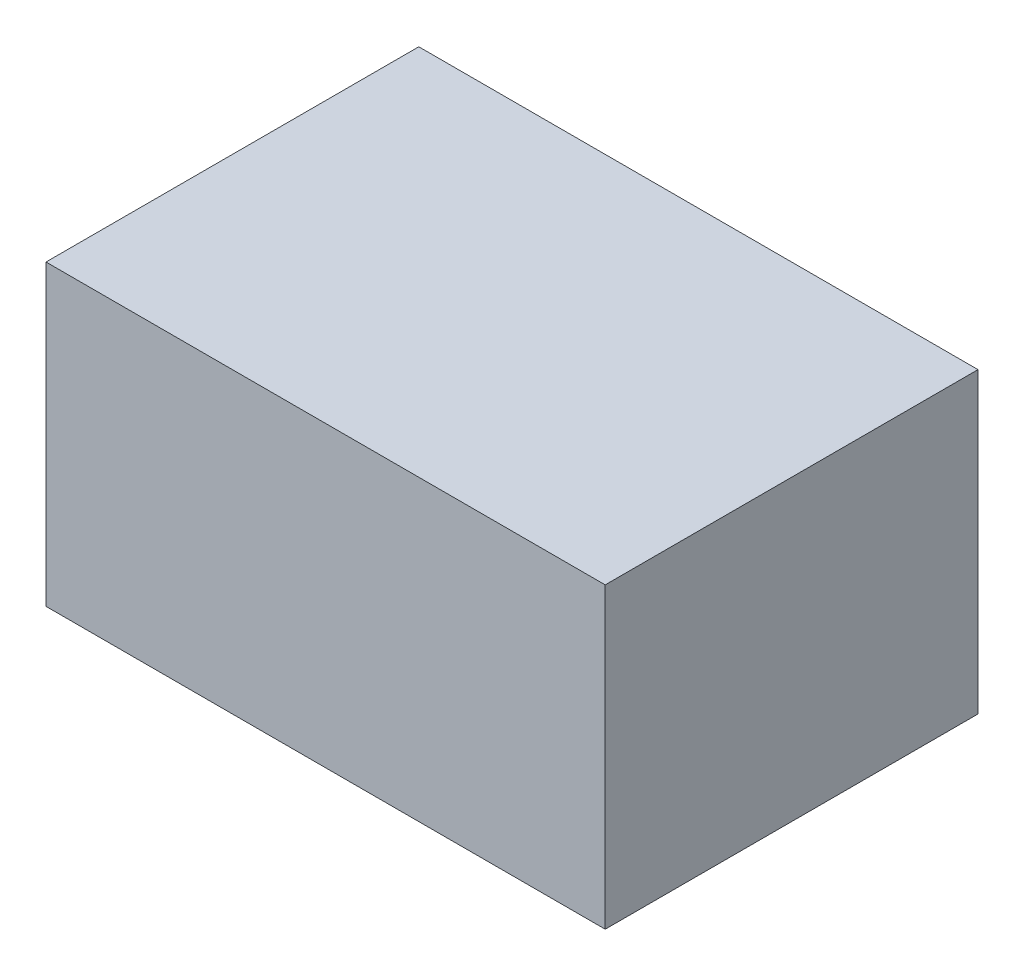
ISO-10303-21;
HEADER;
FILE_DESCRIPTION(('STEP AP214'),'2;1');
FILE_NAME('part.step','',(''),(''),'','','');
FILE_SCHEMA(('AUTOMOTIVE_DESIGN { 1 0 10303 214 1 1 1 1 }'));
ENDSEC;
DATA;
#1=APPLICATION_CONTEXT('core data for automotive mechanical design processes');
#2=APPLICATION_PROTOCOL_DEFINITION('international standard','automotive_design',2000,#1);
#3=PRODUCT_CONTEXT('',#1,'mechanical');
#4=PRODUCT('Part','Part','',(#3));
#5=PRODUCT_RELATED_PRODUCT_CATEGORY('part','',(#4));
#6=PRODUCT_DEFINITION_FORMATION('','',#4);
#7=PRODUCT_DEFINITION_CONTEXT('part definition',#1,'design');
#8=PRODUCT_DEFINITION('design','',#6,#7);
#9=PRODUCT_DEFINITION_SHAPE('','',#8);
#10=(LENGTH_UNIT() NAMED_UNIT(*) SI_UNIT(.MILLI.,.METRE.));
#11=(NAMED_UNIT(*) PLANE_ANGLE_UNIT() SI_UNIT($,.RADIAN.));
#12=(NAMED_UNIT(*) SI_UNIT($,.STERADIAN.) SOLID_ANGLE_UNIT());
#13=UNCERTAINTY_MEASURE_WITH_UNIT(LENGTH_MEASURE(1.E-05),#10,'distance_accuracy_value','');
#14=(GEOMETRIC_REPRESENTATION_CONTEXT(3) GLOBAL_UNCERTAINTY_ASSIGNED_CONTEXT((#13)) GLOBAL_UNIT_ASSIGNED_CONTEXT((#10,
#11,#12)) REPRESENTATION_CONTEXT('',''));
#15=CARTESIAN_POINT('',(0.,0.,0.));
#16=DIRECTION('',(0.,0.,1.));
#17=DIRECTION('',(1.,0.,0.));
#18=AXIS2_PLACEMENT_3D('',#15,#16,#17);
#19=CARTESIAN_POINT('',(30.,16.,-40.));
#20=DIRECTION('',(1.,0.,0.));
#21=DIRECTION('',(0.,1.,0.));
#22=AXIS2_PLACEMENT_3D('',#19,#20,#21);
#23=PLANE('',#22);
#24=DIRECTION('',(0.,1.,0.));
#25=VECTOR('',#24,1.);
#26=CARTESIAN_POINT('',(30.,16.,0.));
#27=LINE('',#26,#25);
#28=CARTESIAN_POINT('',(30.,-16.,0.));
#29=VERTEX_POINT('',#28);
#30=CARTESIAN_POINT('',(30.,16.,0.));
#31=VERTEX_POINT('',#30);
#32=EDGE_CURVE('E109',#29,#31,#27,.T.);
#33=ORIENTED_EDGE('',*,*,#32,.F.);
#34=DIRECTION('',(0.,0.,1.));
#35=VECTOR('',#34,1.);
#36=CARTESIAN_POINT('',(30.,-16.,-40.));
#37=LINE('',#36,#35);
#38=CARTESIAN_POINT('',(30.,-16.,-40.));
#39=VERTEX_POINT('',#38);
#40=EDGE_CURVE('E11',#39,#29,#37,.T.);
#41=ORIENTED_EDGE('',*,*,#40,.F.);
#42=DIRECTION('',(0.,1.,0.));
#43=VECTOR('',#42,1.);
#44=CARTESIAN_POINT('',(30.,16.,-40.));
#45=LINE('',#44,#43);
#46=CARTESIAN_POINT('',(30.,16.,-40.));
#47=VERTEX_POINT('',#46);
#48=EDGE_CURVE('E101',#39,#47,#45,.T.);
#49=ORIENTED_EDGE('',*,*,#48,.T.);
#50=DIRECTION('',(0.,0.,1.));
#51=VECTOR('',#50,1.);
#52=CARTESIAN_POINT('',(30.,16.,-40.));
#53=LINE('',#52,#51);
#54=EDGE_CURVE('E42',#47,#31,#53,.T.);
#55=ORIENTED_EDGE('',*,*,#54,.T.);
#56=EDGE_LOOP('',(#33,#41,#49,#55));
#57=FACE_BOUND('',#56,.T.);
#58=ADVANCED_FACE('F39',(#57),#23,.T.);
#59=CARTESIAN_POINT('',(-30.,-16.,-40.));
#60=DIRECTION('',(0.,-1.,0.));
#61=DIRECTION('',(0.,0.,-1.));
#62=AXIS2_PLACEMENT_3D('',#59,#60,#61);
#63=PLANE('',#62);
#64=DIRECTION('',(1.,0.,0.));
#65=VECTOR('',#64,1.);
#66=CARTESIAN_POINT('',(-30.,-16.,0.));
#67=LINE('',#66,#65);
#68=CARTESIAN_POINT('',(-30.,-16.,0.));
#69=VERTEX_POINT('',#68);
#70=EDGE_CURVE('E104',#69,#29,#67,.T.);
#71=ORIENTED_EDGE('',*,*,#70,.F.);
#72=DIRECTION('',(0.,0.,1.));
#73=VECTOR('',#72,1.);
#74=CARTESIAN_POINT('',(-30.,-16.,-40.));
#75=LINE('',#74,#73);
#76=CARTESIAN_POINT('',(-30.,-16.,-40.));
#77=VERTEX_POINT('',#76);
#78=EDGE_CURVE('E49',#77,#69,#75,.T.);
#79=ORIENTED_EDGE('',*,*,#78,.F.);
#80=DIRECTION('',(1.,0.,0.));
#81=VECTOR('',#80,1.);
#82=CARTESIAN_POINT('',(-30.,-16.,-40.));
#83=LINE('',#82,#81);
#84=EDGE_CURVE('E96',#77,#39,#83,.T.);
#85=ORIENTED_EDGE('',*,*,#84,.T.);
#86=ORIENTED_EDGE('',*,*,#40,.T.);
#87=EDGE_LOOP('',(#71,#79,#85,#86));
#88=FACE_BOUND('',#87,.T.);
#89=ADVANCED_FACE('F125',(#88),#63,.T.);
#90=CARTESIAN_POINT('',(-30.,16.,-40.));
#91=DIRECTION('',(-1.,0.,0.));
#92=DIRECTION('',(0.,-1.,0.));
#93=AXIS2_PLACEMENT_3D('',#90,#91,#92);
#94=PLANE('',#93);
#95=DIRECTION('',(0.,-1.,0.));
#96=VECTOR('',#95,1.);
#97=CARTESIAN_POINT('',(-30.,16.,0.));
#98=LINE('',#97,#96);
#99=CARTESIAN_POINT('',(-30.,16.,0.));
#100=VERTEX_POINT('',#99);
#101=EDGE_CURVE('E90',#100,#69,#98,.T.);
#102=ORIENTED_EDGE('',*,*,#101,.F.);
#103=DIRECTION('',(0.,0.,1.));
#104=VECTOR('',#103,1.);
#105=CARTESIAN_POINT('',(-30.,16.,-40.));
#106=LINE('',#105,#104);
#107=CARTESIAN_POINT('',(-30.,16.,-40.));
#108=VERTEX_POINT('',#107);
#109=EDGE_CURVE('E85',#108,#100,#106,.T.);
#110=ORIENTED_EDGE('',*,*,#109,.F.);
#111=DIRECTION('',(0.,-1.,0.));
#112=VECTOR('',#111,1.);
#113=CARTESIAN_POINT('',(-30.,16.,-40.));
#114=LINE('',#113,#112);
#115=EDGE_CURVE('E88',#108,#77,#114,.T.);
#116=ORIENTED_EDGE('',*,*,#115,.T.);
#117=ORIENTED_EDGE('',*,*,#78,.T.);
#118=EDGE_LOOP('',(#102,#110,#116,#117));
#119=FACE_BOUND('',#118,.T.);
#120=ADVANCED_FACE('F87',(#119),#94,.T.);
#121=CARTESIAN_POINT('',(-30.,16.,-40.));
#122=DIRECTION('',(0.,1.,0.));
#123=DIRECTION('',(0.,0.,1.));
#124=AXIS2_PLACEMENT_3D('',#121,#122,#123);
#125=PLANE('',#124);
#126=DIRECTION('',(-1.,0.,0.));
#127=VECTOR('',#126,1.);
#128=CARTESIAN_POINT('',(-30.,16.,0.));
#129=LINE('',#128,#127);
#130=EDGE_CURVE('E113',#31,#100,#129,.T.);
#131=ORIENTED_EDGE('',*,*,#130,.F.);
#132=ORIENTED_EDGE('',*,*,#54,.F.);
#133=DIRECTION('',(-1.,0.,0.));
#134=VECTOR('',#133,1.);
#135=CARTESIAN_POINT('',(-30.,16.,-40.));
#136=LINE('',#135,#134);
#137=EDGE_CURVE('E95',#47,#108,#136,.T.);
#138=ORIENTED_EDGE('',*,*,#137,.T.);
#139=ORIENTED_EDGE('',*,*,#109,.T.);
#140=EDGE_LOOP('',(#131,#132,#138,#139));
#141=FACE_BOUND('',#140,.T.);
#142=ADVANCED_FACE('F99',(#141),#125,.T.);
#143=CARTESIAN_POINT('',(0.,0.,-40.));
#144=DIRECTION('',(0.,0.,1.));
#145=DIRECTION('',(1.,0.,0.));
#146=AXIS2_PLACEMENT_3D('',#143,#144,#145);
#147=PLANE('',#146);
#148=ORIENTED_EDGE('',*,*,#48,.F.);
#149=ORIENTED_EDGE('',*,*,#84,.F.);
#150=ORIENTED_EDGE('',*,*,#115,.F.);
#151=ORIENTED_EDGE('',*,*,#137,.F.);
#152=EDGE_LOOP('',(#148,#149,#150,#151));
#153=FACE_BOUND('',#152,.T.);
#154=ADVANCED_FACE('F94',(#153),#147,.F.);
#155=CARTESIAN_POINT('',(0.,0.,0.));
#156=DIRECTION('',(0.,0.,1.));
#157=DIRECTION('',(1.,0.,0.));
#158=AXIS2_PLACEMENT_3D('',#155,#156,#157);
#159=PLANE('',#158);
#160=ORIENTED_EDGE('',*,*,#32,.T.);
#161=ORIENTED_EDGE('',*,*,#130,.T.);
#162=ORIENTED_EDGE('',*,*,#101,.T.);
#163=ORIENTED_EDGE('',*,*,#70,.T.);
#164=EDGE_LOOP('',(#160,#161,#162,#163));
#165=FACE_BOUND('',#164,.T.);
#166=ADVANCED_FACE('F124',(#165),#159,.T.);
#167=CLOSED_SHELL('',(#58,#89,#120,#142,#154,#166));
#168=MANIFOLD_SOLID_BREP('B2',#167);
#169=ADVANCED_BREP_SHAPE_REPRESENTATION('',(#18,#168),#14);
#170=SHAPE_DEFINITION_REPRESENTATION(#9,#169);
ENDSEC;
END-ISO-10303-21;
